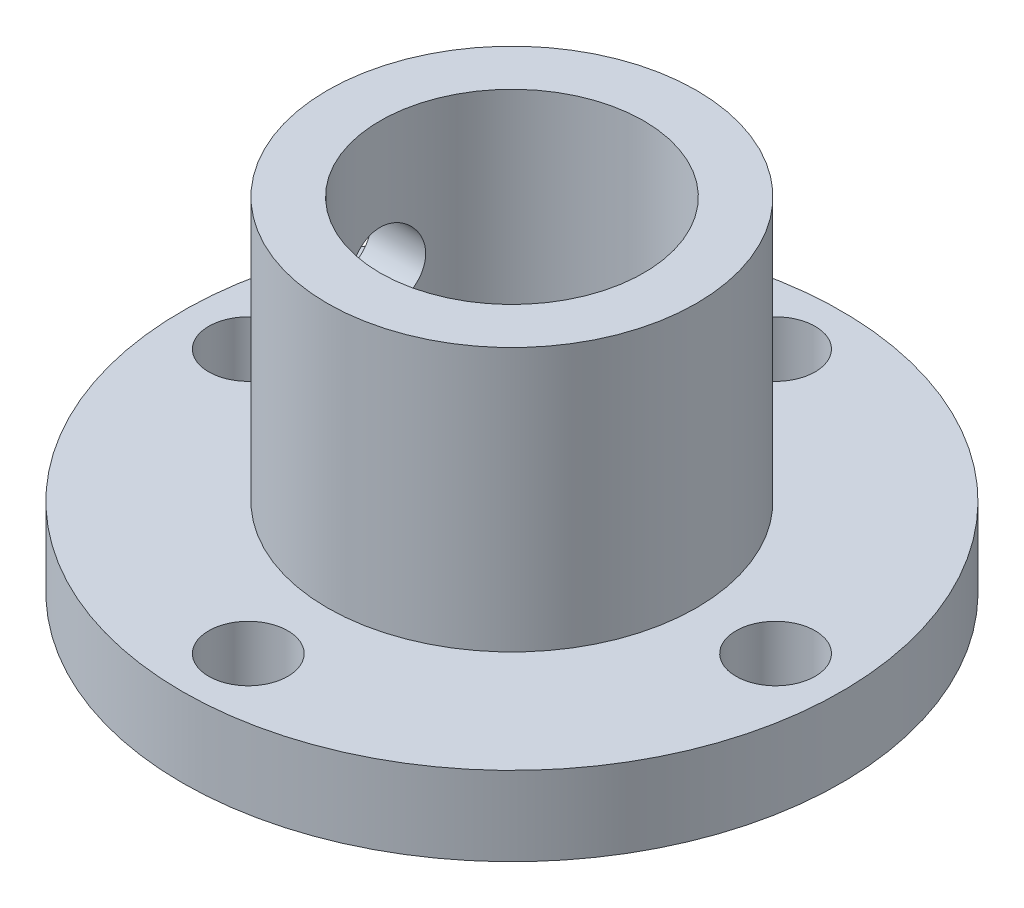
ISO-10303-21;
HEADER;
FILE_DESCRIPTION(('STEP AP214'),'2;1');
FILE_NAME('part.step','',(''),(''),'','','');
FILE_SCHEMA(('AUTOMOTIVE_DESIGN { 1 0 10303 214 1 1 1 1 }'));
ENDSEC;
DATA;
#1=APPLICATION_CONTEXT('core data for automotive mechanical design processes');
#2=APPLICATION_PROTOCOL_DEFINITION('international standard','automotive_design',2000,#1);
#3=PRODUCT_CONTEXT('',#1,'mechanical');
#4=PRODUCT('Part','Part','',(#3));
#5=PRODUCT_RELATED_PRODUCT_CATEGORY('part','',(#4));
#6=PRODUCT_DEFINITION_FORMATION('','',#4);
#7=PRODUCT_DEFINITION_CONTEXT('part definition',#1,'design');
#8=PRODUCT_DEFINITION('design','',#6,#7);
#9=PRODUCT_DEFINITION_SHAPE('','',#8);
#10=(LENGTH_UNIT() NAMED_UNIT(*) SI_UNIT(.MILLI.,.METRE.));
#11=(NAMED_UNIT(*) PLANE_ANGLE_UNIT() SI_UNIT($,.RADIAN.));
#12=(NAMED_UNIT(*) SI_UNIT($,.STERADIAN.) SOLID_ANGLE_UNIT());
#13=UNCERTAINTY_MEASURE_WITH_UNIT(LENGTH_MEASURE(1.E-05),#10,'distance_accuracy_value','');
#14=(GEOMETRIC_REPRESENTATION_CONTEXT(3) GLOBAL_UNCERTAINTY_ASSIGNED_CONTEXT((#13)) GLOBAL_UNIT_ASSIGNED_CONTEXT((#10,
#11,#12)) REPRESENTATION_CONTEXT('',''));
#15=CARTESIAN_POINT('',(0.,0.,0.));
#16=DIRECTION('',(0.,0.,1.));
#17=DIRECTION('',(1.,0.,0.));
#18=AXIS2_PLACEMENT_3D('',#15,#16,#17);
#19=CARTESIAN_POINT('',(0.,3.,0.));
#20=DIRECTION('',(0.,1.,0.));
#21=DIRECTION('',(0.,0.,1.));
#22=AXIS2_PLACEMENT_3D('',#19,#20,#21);
#23=PLANE('',#22);
#24=CARTESIAN_POINT('',(0.,3.,0.));
#25=DIRECTION('',(0.,1.,0.));
#26=DIRECTION('',(1.,0.,0.));
#27=AXIS2_PLACEMENT_3D('',#24,#25,#26);
#28=CIRCLE('',#27,7.);
#29=CARTESIAN_POINT('',(7.,3.,0.));
#30=VERTEX_POINT('',#29);
#31=EDGE_CURVE('E90',#30,#30,#28,.T.);
#32=ORIENTED_EDGE('',*,*,#31,.F.);
#33=EDGE_LOOP('',(#32));
#34=FACE_BOUND('',#33,.T.);
#35=CARTESIAN_POINT('',(-10.,3.,0.));
#36=DIRECTION('',(0.,1.,0.));
#37=DIRECTION('',(0.,0.,1.));
#38=AXIS2_PLACEMENT_3D('',#35,#36,#37);
#39=CIRCLE('',#38,1.5);
#40=CARTESIAN_POINT('',(-10.,3.,1.5));
#41=VERTEX_POINT('',#40);
#42=EDGE_CURVE('E75',#41,#41,#39,.T.);
#43=ORIENTED_EDGE('',*,*,#42,.F.);
#44=EDGE_LOOP('',(#43));
#45=FACE_BOUND('',#44,.T.);
#46=CARTESIAN_POINT('',(10.,3.,0.));
#47=DIRECTION('',(0.,1.,0.));
#48=DIRECTION('',(0.,0.,1.));
#49=AXIS2_PLACEMENT_3D('',#46,#47,#48);
#50=CIRCLE('',#49,1.5);
#51=CARTESIAN_POINT('',(10.,3.,1.5));
#52=VERTEX_POINT('',#51);
#53=EDGE_CURVE('E64',#52,#52,#50,.T.);
#54=ORIENTED_EDGE('',*,*,#53,.F.);
#55=EDGE_LOOP('',(#54));
#56=FACE_BOUND('',#55,.T.);
#57=CARTESIAN_POINT('',(0.,3.,0.));
#58=DIRECTION('',(0.,1.,0.));
#59=DIRECTION('',(0.,0.,1.));
#60=AXIS2_PLACEMENT_3D('',#57,#58,#59);
#61=CIRCLE('',#60,12.5);
#62=CARTESIAN_POINT('',(0.,3.,12.5));
#63=VERTEX_POINT('',#62);
#64=EDGE_CURVE('E56',#63,#63,#61,.T.);
#65=ORIENTED_EDGE('',*,*,#64,.T.);
#66=EDGE_LOOP('',(#65));
#67=FACE_BOUND('',#66,.T.);
#68=CARTESIAN_POINT('',(0.,3.,10.));
#69=DIRECTION('',(0.,1.,0.));
#70=DIRECTION('',(0.,0.,1.));
#71=AXIS2_PLACEMENT_3D('',#68,#69,#70);
#72=CIRCLE('',#71,1.5);
#73=CARTESIAN_POINT('',(0.,3.,11.5));
#74=VERTEX_POINT('',#73);
#75=EDGE_CURVE('E69',#74,#74,#72,.T.);
#76=ORIENTED_EDGE('',*,*,#75,.F.);
#77=EDGE_LOOP('',(#76));
#78=FACE_BOUND('',#77,.T.);
#79=CARTESIAN_POINT('',(0.,3.,-10.));
#80=DIRECTION('',(0.,1.,0.));
#81=DIRECTION('',(0.,0.,1.));
#82=AXIS2_PLACEMENT_3D('',#79,#80,#81);
#83=CIRCLE('',#82,1.5);
#84=CARTESIAN_POINT('',(0.,3.,-8.5));
#85=VERTEX_POINT('',#84);
#86=EDGE_CURVE('E81',#85,#85,#83,.T.);
#87=ORIENTED_EDGE('',*,*,#86,.F.);
#88=EDGE_LOOP('',(#87));
#89=FACE_BOUND('',#88,.T.);
#90=ADVANCED_FACE('F43',(#34,#45,#56,#67,#78,#89),#23,.T.);
#91=CARTESIAN_POINT('',(0.,0.,0.));
#92=DIRECTION('',(0.,1.,0.));
#93=DIRECTION('',(0.,0.,1.));
#94=AXIS2_PLACEMENT_3D('',#91,#92,#93);
#95=PLANE('',#94);
#96=CARTESIAN_POINT('',(0.,0.,0.));
#97=DIRECTION('',(0.,1.,0.));
#98=DIRECTION('',(0.,0.,1.));
#99=AXIS2_PLACEMENT_3D('',#96,#97,#98);
#100=CIRCLE('',#99,12.5);
#101=CARTESIAN_POINT('',(0.,0.,12.5));
#102=VERTEX_POINT('',#101);
#103=EDGE_CURVE('E60',#102,#102,#100,.T.);
#104=ORIENTED_EDGE('',*,*,#103,.F.);
#105=EDGE_LOOP('',(#104));
#106=FACE_BOUND('',#105,.T.);
#107=CARTESIAN_POINT('',(10.,0.,0.));
#108=DIRECTION('',(0.,1.,0.));
#109=DIRECTION('',(0.,0.,1.));
#110=AXIS2_PLACEMENT_3D('',#107,#108,#109);
#111=CIRCLE('',#110,1.5);
#112=CARTESIAN_POINT('',(10.,0.,1.5));
#113=VERTEX_POINT('',#112);
#114=EDGE_CURVE('E66',#113,#113,#111,.T.);
#115=ORIENTED_EDGE('',*,*,#114,.T.);
#116=EDGE_LOOP('',(#115));
#117=FACE_BOUND('',#116,.T.);
#118=CARTESIAN_POINT('',(0.,0.,10.));
#119=DIRECTION('',(0.,1.,0.));
#120=DIRECTION('',(0.,0.,1.));
#121=AXIS2_PLACEMENT_3D('',#118,#119,#120);
#122=CIRCLE('',#121,1.5);
#123=CARTESIAN_POINT('',(0.,0.,11.5));
#124=VERTEX_POINT('',#123);
#125=EDGE_CURVE('E72',#124,#124,#122,.T.);
#126=ORIENTED_EDGE('',*,*,#125,.T.);
#127=EDGE_LOOP('',(#126));
#128=FACE_BOUND('',#127,.T.);
#129=CARTESIAN_POINT('',(-10.,0.,0.));
#130=DIRECTION('',(0.,1.,0.));
#131=DIRECTION('',(0.,0.,1.));
#132=AXIS2_PLACEMENT_3D('',#129,#130,#131);
#133=CIRCLE('',#132,1.5);
#134=CARTESIAN_POINT('',(-10.,0.,1.5));
#135=VERTEX_POINT('',#134);
#136=EDGE_CURVE('E78',#135,#135,#133,.T.);
#137=ORIENTED_EDGE('',*,*,#136,.T.);
#138=EDGE_LOOP('',(#137));
#139=FACE_BOUND('',#138,.T.);
#140=CARTESIAN_POINT('',(0.,0.,-10.));
#141=DIRECTION('',(0.,1.,0.));
#142=DIRECTION('',(0.,0.,1.));
#143=AXIS2_PLACEMENT_3D('',#140,#141,#142);
#144=CIRCLE('',#143,1.5);
#145=CARTESIAN_POINT('',(0.,0.,-8.5));
#146=VERTEX_POINT('',#145);
#147=EDGE_CURVE('E84',#146,#146,#144,.T.);
#148=ORIENTED_EDGE('',*,*,#147,.T.);
#149=EDGE_LOOP('',(#148));
#150=FACE_BOUND('',#149,.T.);
#151=ADVANCED_FACE('F131',(#106,#117,#128,#139,#150),#95,.F.);
#152=CARTESIAN_POINT('',(0.,3.,0.));
#153=DIRECTION('',(0.,-1.,0.));
#154=DIRECTION('',(0.,0.,-1.));
#155=AXIS2_PLACEMENT_3D('',#152,#153,#154);
#156=CYLINDRICAL_SURFACE('',#155,12.5);
#157=ORIENTED_EDGE('',*,*,#64,.F.);
#158=EDGE_LOOP('',(#157));
#159=FACE_BOUND('',#158,.T.);
#160=ORIENTED_EDGE('',*,*,#103,.T.);
#161=EDGE_LOOP('',(#160));
#162=FACE_BOUND('',#161,.T.);
#163=ADVANCED_FACE('F45',(#159,#162),#156,.T.);
#164=CARTESIAN_POINT('',(10.,3.,0.));
#165=DIRECTION('',(0.,-1.,0.));
#166=DIRECTION('',(0.,0.,-1.));
#167=AXIS2_PLACEMENT_3D('',#164,#165,#166);
#168=CYLINDRICAL_SURFACE('',#167,1.5);
#169=ORIENTED_EDGE('',*,*,#53,.T.);
#170=EDGE_LOOP('',(#169));
#171=FACE_BOUND('',#170,.T.);
#172=ORIENTED_EDGE('',*,*,#114,.F.);
#173=EDGE_LOOP('',(#172));
#174=FACE_BOUND('',#173,.T.);
#175=ADVANCED_FACE('F204',(#171,#174),#168,.F.);
#176=CARTESIAN_POINT('',(0.,3.,10.));
#177=DIRECTION('',(0.,-1.,0.));
#178=DIRECTION('',(0.,0.,-1.));
#179=AXIS2_PLACEMENT_3D('',#176,#177,#178);
#180=CYLINDRICAL_SURFACE('',#179,1.5);
#181=ORIENTED_EDGE('',*,*,#75,.T.);
#182=EDGE_LOOP('',(#181));
#183=FACE_BOUND('',#182,.T.);
#184=ORIENTED_EDGE('',*,*,#125,.F.);
#185=EDGE_LOOP('',(#184));
#186=FACE_BOUND('',#185,.T.);
#187=ADVANCED_FACE('F193',(#183,#186),#180,.F.);
#188=CARTESIAN_POINT('',(-10.,3.,0.));
#189=DIRECTION('',(0.,-1.,0.));
#190=DIRECTION('',(0.,0.,-1.));
#191=AXIS2_PLACEMENT_3D('',#188,#189,#190);
#192=CYLINDRICAL_SURFACE('',#191,1.5);
#193=ORIENTED_EDGE('',*,*,#42,.T.);
#194=EDGE_LOOP('',(#193));
#195=FACE_BOUND('',#194,.T.);
#196=ORIENTED_EDGE('',*,*,#136,.F.);
#197=EDGE_LOOP('',(#196));
#198=FACE_BOUND('',#197,.T.);
#199=ADVANCED_FACE('F127',(#195,#198),#192,.F.);
#200=CARTESIAN_POINT('',(0.,3.,-10.));
#201=DIRECTION('',(0.,-1.,0.));
#202=DIRECTION('',(0.,0.,-1.));
#203=AXIS2_PLACEMENT_3D('',#200,#201,#202);
#204=CYLINDRICAL_SURFACE('',#203,1.5);
#205=ORIENTED_EDGE('',*,*,#86,.T.);
#206=EDGE_LOOP('',(#205));
#207=FACE_BOUND('',#206,.T.);
#208=ORIENTED_EDGE('',*,*,#147,.F.);
#209=EDGE_LOOP('',(#208));
#210=FACE_BOUND('',#209,.T.);
#211=ADVANCED_FACE('F120',(#207,#210),#204,.F.);
#212=CARTESIAN_POINT('',(0.,13.,0.));
#213=DIRECTION('',(0.,1.,0.));
#214=DIRECTION('',(0.,0.,1.));
#215=AXIS2_PLACEMENT_3D('',#212,#213,#214);
#216=PLANE('',#215);
#217=CARTESIAN_POINT('',(0.,13.,0.));
#218=DIRECTION('',(0.,1.,0.));
#219=DIRECTION('',(1.,0.,0.));
#220=AXIS2_PLACEMENT_3D('',#217,#218,#219);
#221=CIRCLE('',#220,7.);
#222=CARTESIAN_POINT('',(7.,13.,0.));
#223=VERTEX_POINT('',#222);
#224=EDGE_CURVE('E87',#223,#223,#221,.T.);
#225=ORIENTED_EDGE('',*,*,#224,.T.);
#226=EDGE_LOOP('',(#225));
#227=FACE_BOUND('',#226,.T.);
#228=CARTESIAN_POINT('',(0.,13.,0.));
#229=DIRECTION('',(0.,1.,0.));
#230=DIRECTION('',(0.,0.,1.));
#231=AXIS2_PLACEMENT_3D('',#228,#229,#230);
#232=CIRCLE('',#231,5.);
#233=CARTESIAN_POINT('',(0.,13.,5.));
#234=VERTEX_POINT('',#233);
#235=EDGE_CURVE('E93',#234,#234,#232,.T.);
#236=ORIENTED_EDGE('',*,*,#235,.F.);
#237=EDGE_LOOP('',(#236));
#238=FACE_BOUND('',#237,.T.);
#239=ADVANCED_FACE('F118',(#227,#238),#216,.T.);
#240=CARTESIAN_POINT('',(0.,13.,0.));
#241=DIRECTION('',(0.,-1.,0.));
#242=DIRECTION('',(0.,0.,-1.));
#243=AXIS2_PLACEMENT_3D('',#240,#241,#242);
#244=CYLINDRICAL_SURFACE('',#243,7.);
#245=CARTESIAN_POINT('',(-6.83739716558867,8.,-1.5));
#246=CARTESIAN_POINT('',(-6.83739884558951,8.08321115248195,-1.49999708238613));
#247=CARTESIAN_POINT('',(-6.83893272341929,8.16645777394212,-1.49305236244768));
#248=CARTESIAN_POINT('',(-6.84489178429867,8.33058667224201,-1.46548559252999));
#249=CARTESIAN_POINT('',(-6.84931911211841,8.41146714867621,-1.44485339653622));
#250=CARTESIAN_POINT('',(-6.86054115293409,8.5684657495742,-1.39058863684599));
#251=CARTESIAN_POINT('',(-6.86733332725825,8.64458887812147,-1.35697000991314));
#252=CARTESIAN_POINT('',(-6.88251670848644,8.79011527394461,-1.27772617673341));
#253=CARTESIAN_POINT('',(-6.89090786877545,8.85951873702908,-1.23210132048776));
#254=CARTESIAN_POINT('',(-6.90849578796654,8.99076296148212,-1.12935142570221));
#255=CARTESIAN_POINT('',(-6.91770249871754,9.05247887623996,-1.07206859483983));
#256=CARTESIAN_POINT('',(-6.93579691710397,9.16550355440578,-0.947969508129577));
#257=CARTESIAN_POINT('',(-6.94468460051417,9.21681152886007,-0.881152530217676));
#258=CARTESIAN_POINT('',(-6.96124769109432,9.30805544449143,-0.739047288464582));
#259=CARTESIAN_POINT('',(-6.96890998819429,9.34787165577062,-0.663680488229954));
#260=CARTESIAN_POINT('',(-6.98204671042934,9.41422769144629,-0.507134269342596));
#261=CARTESIAN_POINT('',(-6.98752137103329,9.44076894478628,-0.425955477380312));
#262=CARTESIAN_POINT('',(-6.9955956528118,9.47942997093134,-0.261387187671512));
#263=CARTESIAN_POINT('',(-6.99823733378385,9.49176092855243,-0.178049400596923));
#264=CARTESIAN_POINT('',(-7.00049362207002,9.50231127731326,-0.0104489453066449));
#265=CARTESIAN_POINT('',(-7.00010856232698,9.50053222056076,0.0738136201647589));
#266=CARTESIAN_POINT('',(-6.99638700862558,9.48307103533642,0.239417029250511));
#267=CARTESIAN_POINT('',(-6.99309883152432,9.46761649971008,0.320783115362112));
#268=CARTESIAN_POINT('',(-6.98399541589104,9.42360531814814,0.479739463978388));
#269=CARTESIAN_POINT('',(-6.97818006616518,9.39504809570026,0.557329560175054));
#270=CARTESIAN_POINT('',(-6.96459754646858,9.32543854111148,0.707167497556552));
#271=CARTESIAN_POINT('',(-6.95681685803946,9.28429923279565,0.779373657015788));
#272=CARTESIAN_POINT('',(-6.94015793743865,9.1907580318364,0.915940926562845));
#273=CARTESIAN_POINT('',(-6.93127956144693,9.1383546626997,0.980301006451528));
#274=CARTESIAN_POINT('',(-6.91319326460925,9.02253145547214,1.10070208800198));
#275=CARTESIAN_POINT('',(-6.90398230372853,8.95891242064296,1.1565511732025));
#276=CARTESIAN_POINT('',(-6.88643566831974,8.82311671493149,1.25682243234728));
#277=CARTESIAN_POINT('',(-6.87810001563386,8.75093983059475,1.30124432118068));
#278=CARTESIAN_POINT('',(-6.86324023586723,8.59977549893624,1.37748077573296));
#279=CARTESIAN_POINT('',(-6.85672115127775,8.52076987614756,1.40926035088923));
#280=CARTESIAN_POINT('',(-6.84630340806617,8.35836723405356,1.45903495159115));
#281=CARTESIAN_POINT('',(-6.84240435218483,8.27497088255681,1.47703206694628));
#282=CARTESIAN_POINT('',(-6.83774881255446,8.10790424735029,1.49843586024652));
#283=CARTESIAN_POINT('',(-6.83693227051701,8.0242713249227,1.5021214192864));
#284=CARTESIAN_POINT('',(-6.83837239573993,7.85758600681831,1.49555139642373));
#285=CARTESIAN_POINT('',(-6.84062886101063,7.77453357334645,1.48529673081635));
#286=CARTESIAN_POINT('',(-6.84790415484206,7.61232956501924,1.45137894635584));
#287=CARTESIAN_POINT('',(-6.85289155274364,7.53314456740304,1.42786830251553));
#288=CARTESIAN_POINT('',(-6.86503859869777,7.37983766246708,1.36827052946749));
#289=CARTESIAN_POINT('',(-6.87219844772849,7.30571622436581,1.33218223662818));
#290=CARTESIAN_POINT('',(-6.88801634080345,7.16343031524108,1.24783504416705));
#291=CARTESIAN_POINT('',(-6.89669501746317,7.09537041798782,1.19940368590792));
#292=CARTESIAN_POINT('',(-6.91451775360139,6.96824165412621,1.09197183833601));
#293=CARTESIAN_POINT('',(-6.92366186834461,6.90917385855153,1.03297009182161));
#294=CARTESIAN_POINT('',(-6.94158239990173,6.80062969705524,0.904812764420814));
#295=CARTESIAN_POINT('',(-6.95034935607746,6.75134308384299,0.835494925828771));
#296=CARTESIAN_POINT('',(-6.96635610714901,6.66511459064895,0.689401481282277));
#297=CARTESIAN_POINT('',(-6.97359597176692,6.62817214702717,0.61262621604374));
#298=CARTESIAN_POINT('',(-6.98569278381574,6.56794794536152,0.454265418982041));
#299=CARTESIAN_POINT('',(-6.99056443803698,6.54458169625372,0.372713193075173));
#300=CARTESIAN_POINT('',(-6.9974393930198,6.51190829426768,0.20672517700329));
#301=CARTESIAN_POINT('',(-6.99944309312296,6.50259918402609,0.122289789973994));
#302=CARTESIAN_POINT('',(-7.00034511009057,6.49838934758814,-0.0452637170528279));
#303=CARTESIAN_POINT('',(-6.99930459001667,6.50320484139538,-0.128374505509228));
#304=CARTESIAN_POINT('',(-6.99436552363383,6.52647476351903,-0.292572938415959));
#305=CARTESIAN_POINT('',(-6.99046702473686,6.54492896557832,-0.373660616405284));
#306=CARTESIAN_POINT('',(-6.98025388638537,6.59481880624949,-0.531301948487269));
#307=CARTESIAN_POINT('',(-6.97394646430492,6.62621568938556,-0.607868365073176));
#308=CARTESIAN_POINT('',(-6.95959036050661,6.70106127116912,-0.754684956723219));
#309=CARTESIAN_POINT('',(-6.9515415172034,6.74451108830603,-0.82493454479614));
#310=CARTESIAN_POINT('',(-6.93439809934494,6.84316231874267,-0.958512306895243));
#311=CARTESIAN_POINT('',(-6.92528708907874,6.89856415832131,-1.02169036510577));
#312=CARTESIAN_POINT('',(-6.90713690075836,7.01914061025035,-1.13795001457643));
#313=CARTESIAN_POINT('',(-6.89809774045682,7.08431756335561,-1.19102918062422));
#314=CARTESIAN_POINT('',(-6.88098693651916,7.22359049318568,-1.28623261596675));
#315=CARTESIAN_POINT('',(-6.87292905956533,7.29778935828702,-1.32820897809616));
#316=CARTESIAN_POINT('',(-6.85886497228049,7.45234372092325,-1.39903004659825));
#317=CARTESIAN_POINT('',(-6.85285699581573,7.53269384525307,-1.42788606423931));
#318=CARTESIAN_POINT('',(-6.84470560641996,7.67762613118586,-1.46638607121557));
#319=CARTESIAN_POINT('',(-6.84198283087953,7.74141167570783,-1.47896752507743));
#320=CARTESIAN_POINT('',(-6.83832799504406,7.87012431157732,-1.49577544043437));
#321=CARTESIAN_POINT('',(-6.83739585430069,7.93505135150832,-1.50000227727981));
#322=CARTESIAN_POINT('',(-6.83739716558867,8.,-1.5));
#323=B_SPLINE_CURVE_WITH_KNOTS('',3,(#245,#246,#247,#248,#249,#250,#251,#252,#253,#254,#255,
#256,#257,#258,#259,#260,#261,#262,#263,#264,#265,#266,#267,#268,#269,#270,#271,#272,#273,#274,
#275,#276,#277,#278,#279,#280,#281,#282,#283,#284,#285,#286,#287,#288,#289,#290,#291,#292,#293,
#294,#295,#296,#297,#298,#299,#300,#301,#302,#303,#304,#305,#306,#307,#308,#309,#310,#311,#312,
#313,#314,#315,#316,#317,#318,#319,#320,#321,#322),.UNSPECIFIED.,.T.,.F.,(4,2,2,2,2,2,2,2,2,2,2,
2,2,2,2,2,2,2,2,2,2,2,2,2,2,2,2,2,2,2,2,2,2,2,2,2,2,2,4),(0.,0.249395482027529,
0.498976038479964,0.748289491152758,0.997595676735284,1.25053229582692,1.50348808112879,
1.75899134820278,2.01446710646268,2.26609508151929,2.51769537777241,2.76518557667371,
3.01268666607584,3.26193888143437,3.51122378872315,3.76548960779295,4.01976177023092,
4.27473287411781,4.52966530953839,4.77960433192523,5.02952692653916,5.27663180749375,
5.5237595556315,5.77455010216318,6.02537049659078,6.2806621468321,6.53594213875541,
6.78961589824375,7.04325433208539,7.29183199644126,7.54040553715099,7.78824009619483,
8.03609766151365,8.28848914160965,8.54094115631232,8.79660380167248,9.05204561611687,
9.24671456122271,9.44137476018022),.UNSPECIFIED.);
#324=CARTESIAN_POINT('',(-6.83739716558867,8.,-1.5));
#325=VERTEX_POINT('',#324);
#326=EDGE_CURVE('E98',#325,#325,#323,.T.);
#327=ORIENTED_EDGE('',*,*,#326,.T.);
#328=EDGE_LOOP('',(#327));
#329=FACE_BOUND('',#328,.T.);
#330=ORIENTED_EDGE('',*,*,#224,.F.);
#331=EDGE_LOOP('',(#330));
#332=FACE_BOUND('',#331,.T.);
#333=ORIENTED_EDGE('',*,*,#31,.T.);
#334=EDGE_LOOP('',(#333));
#335=FACE_BOUND('',#334,.T.);
#336=ADVANCED_FACE('F104',(#329,#332,#335),#244,.T.);
#337=CARTESIAN_POINT('',(0.,13.,0.));
#338=DIRECTION('',(0.,-1.,0.));
#339=DIRECTION('',(0.,0.,-1.));
#340=AXIS2_PLACEMENT_3D('',#337,#338,#339);
#341=CYLINDRICAL_SURFACE('',#340,5.);
#342=CARTESIAN_POINT('',(-4.76969600708473,8.,-1.5));
#343=CARTESIAN_POINT('',(-4.7696968572698,8.0821945479424,-1.49999897633764));
#344=CARTESIAN_POINT('',(-4.77184390209069,8.16439922414402,-1.49322108167142));
#345=CARTESIAN_POINT('',(-4.780165783029,8.32640524959194,-1.46635844446749));
#346=CARTESIAN_POINT('',(-4.78634196493468,8.40620578650146,-1.44626925573578));
#347=CARTESIAN_POINT('',(-4.80196102485632,8.56103472827173,-1.39352753269955));
#348=CARTESIAN_POINT('',(-4.81139846703232,8.63607082963309,-1.36089589394243));
#349=CARTESIAN_POINT('',(-4.83246932547567,8.7796219339953,-1.28406421917929));
#350=CARTESIAN_POINT('',(-4.84410307041019,8.84813595868444,-1.23986245137053));
#351=CARTESIAN_POINT('',(-4.86866862185765,8.97886639057737,-1.13964754141627));
#352=CARTESIAN_POINT('',(-4.88162808311636,9.04084589794629,-1.08333207175807));
#353=CARTESIAN_POINT('',(-4.90714861936757,9.15463795132251,-0.9611362375796));
#354=CARTESIAN_POINT('',(-4.91970964297705,9.20644919044988,-0.895254645461112));
#355=CARTESIAN_POINT('',(-4.94333214579389,9.29946269983331,-0.754111437793691));
#356=CARTESIAN_POINT('',(-4.95435724342404,9.34042342444281,-0.678684021335816));
#357=CARTESIAN_POINT('',(-4.97334435920684,9.40898725904276,-0.521624645369355));
#358=CARTESIAN_POINT('',(-4.98130703789495,9.43659324985745,-0.439994028387913));
#359=CARTESIAN_POINT('',(-4.99307646003589,9.47688000109051,-0.27532385263083));
#360=CARTESIAN_POINT('',(-4.99699557369338,9.4899651276527,-0.192391398953802));
#361=CARTESIAN_POINT('',(-5.00063201501348,9.50211732464644,-0.0254218237493157));
#362=CARTESIAN_POINT('',(-5.00035022521079,9.50118733940196,0.0586150620503675));
#363=CARTESIAN_POINT('',(-4.99569603817659,9.48560713145698,0.222571156600159));
#364=CARTESIAN_POINT('',(-4.9914542020526,9.47139480619013,0.30253626764134));
#365=CARTESIAN_POINT('',(-4.97951522112593,9.43036866400571,0.458889213442526));
#366=CARTESIAN_POINT('',(-4.97181785750586,9.40355404905733,0.535276821322845));
#367=CARTESIAN_POINT('',(-4.95365220986963,9.33778797658144,0.68334732635128));
#368=CARTESIAN_POINT('',(-4.94315269676706,9.29869879719273,0.754965064694477));
#369=CARTESIAN_POINT('',(-4.92049640648069,9.20960214757177,0.890764673783155));
#370=CARTESIAN_POINT('',(-4.90833923637778,9.15959208703652,0.95494477487213));
#371=CARTESIAN_POINT('',(-4.88311550488166,9.0478022492484,1.0766604815298));
#372=CARTESIAN_POINT('',(-4.87003195321461,8.98564308097026,1.13384458040111));
#373=CARTESIAN_POINT('',(-4.84483979887497,8.85248998210995,1.23707651539823));
#374=CARTESIAN_POINT('',(-4.8327312931702,8.78149517461077,1.28312324482852));
#375=CARTESIAN_POINT('',(-4.81077903197678,8.63176053075101,1.3631399533545));
#376=CARTESIAN_POINT('',(-4.80095810695957,8.55295295413708,1.39698989237679));
#377=CARTESIAN_POINT('',(-4.78496392548436,8.39039279155446,1.45083362878413));
#378=CARTESIAN_POINT('',(-4.7787894791583,8.30664182846544,1.4708319464056));
#379=CARTESIAN_POINT('',(-4.77104849541241,8.13991763926072,1.49574770282165));
#380=CARTESIAN_POINT('',(-4.76931878670441,8.05703177610602,1.50119946380212));
#381=CARTESIAN_POINT('',(-4.77021192441924,7.89152709999014,1.49835947233062));
#382=CARTESIAN_POINT('',(-4.77283416156589,7.80890825126915,1.4900696437133));
#383=CARTESIAN_POINT('',(-4.78197558554912,7.64851162202913,1.4604576357419));
#384=CARTESIAN_POINT('',(-4.78839176507489,7.57066383573648,1.4394796143128));
#385=CARTESIAN_POINT('',(-4.80429141231227,7.41959830918509,1.3854857774794));
#386=CARTESIAN_POINT('',(-4.81377535359073,7.34638128585943,1.3524681034276));
#387=CARTESIAN_POINT('',(-4.83505835023047,7.20448253592787,1.274318711965));
#388=CARTESIAN_POINT('',(-4.84691271069799,7.13597527901421,1.22888564172729));
#389=CARTESIAN_POINT('',(-4.87148205646987,7.0073618938192,1.12755301600385));
#390=CARTESIAN_POINT('',(-4.88419724730003,6.94725778238721,1.07165095534897));
#391=CARTESIAN_POINT('',(-4.90963633548158,6.83481959418526,0.9484551324936));
#392=CARTESIAN_POINT('',(-4.92234245063004,6.78286437101302,0.880811065857435));
#393=CARTESIAN_POINT('',(-4.94584851748651,6.69103329897225,0.73746178459025));
#394=CARTESIAN_POINT('',(-4.95664856384717,6.65115685021854,0.661756970543945));
#395=CARTESIAN_POINT('',(-4.97505970474957,6.58499996943171,0.504935504705222));
#396=CARTESIAN_POINT('',(-4.98269453424966,6.55861798384103,0.42386462203784));
#397=CARTESIAN_POINT('',(-4.99401979596827,6.51993908110958,0.258169966504589));
#398=CARTESIAN_POINT('',(-4.9977113567088,6.50763813405158,0.173547217354764));
#399=CARTESIAN_POINT('',(-5.00066544081399,6.4977769559455,0.00665215388274413));
#400=CARTESIAN_POINT('',(-5.00009305111322,6.49966730459217,-0.0755851790862051));
#401=CARTESIAN_POINT('',(-4.99497264465037,6.51682163249912,-0.238519481164402));
#402=CARTESIAN_POINT('',(-4.99042485330462,6.53208485348044,-0.319216537346527));
#403=CARTESIAN_POINT('',(-4.97791168358327,6.57521166139962,-0.475935813041357));
#404=CARTESIAN_POINT('',(-4.96998352900866,6.60293818064901,-0.55199892735139));
#405=CARTESIAN_POINT('',(-4.9515294303945,6.67008191450719,-0.698433237752051));
#406=CARTESIAN_POINT('',(-4.94100305949946,6.70950105028619,-0.768803496050578));
#407=CARTESIAN_POINT('',(-4.91803965828228,6.80037345743004,-0.904301892420563));
#408=CARTESIAN_POINT('',(-4.90555226923559,6.85217143000077,-0.969190250076767));
#409=CARTESIAN_POINT('',(-4.88023537212334,6.9657103883328,-1.08953757134594));
#410=CARTESIAN_POINT('',(-4.86740576641079,7.02745423789815,-1.14499380960193));
#411=CARTESIAN_POINT('',(-4.84240680631319,7.16134077831051,-1.24656269394549));
#412=CARTESIAN_POINT('',(-4.83026852693485,7.23373855339044,-1.29234759757956));
#413=CARTESIAN_POINT('',(-4.80852547508793,7.38555517416102,-1.37104313528776));
#414=CARTESIAN_POINT('',(-4.79891948596955,7.46497062360119,-1.40395995557288));
#415=CARTESIAN_POINT('',(-4.78427816717595,7.61974043160627,-1.45301942532949));
#416=CARTESIAN_POINT('',(-4.7788615484052,7.69460864693099,-1.47058859011232));
#417=CARTESIAN_POINT('',(-4.77157042597167,7.84631522249577,-1.49407818835144));
#418=CARTESIAN_POINT('',(-4.7696952122143,7.92315318464525,-1.50000095706095));
#419=CARTESIAN_POINT('',(-4.76969600708473,8.,-1.5));
#420=B_SPLINE_CURVE_WITH_KNOTS('',3,(#342,#343,#344,#345,#346,#347,#348,#349,#350,#351,#352,
#353,#354,#355,#356,#357,#358,#359,#360,#361,#362,#363,#364,#365,#366,#367,#368,#369,#370,#371,
#372,#373,#374,#375,#376,#377,#378,#379,#380,#381,#382,#383,#384,#385,#386,#387,#388,#389,#390,
#391,#392,#393,#394,#395,#396,#397,#398,#399,#400,#401,#402,#403,#404,#405,#406,#407,#408,#409,
#410,#411,#412,#413,#414,#415,#416,#417,#418,#419),.UNSPECIFIED.,.T.,.F.,(4,2,2,2,2,2,2,2,2,2,2,
2,2,2,2,2,2,2,2,2,2,2,2,2,2,2,2,2,2,2,2,2,2,2,2,2,2,2,4),(0.,0.246300165915542,
0.492682641688999,0.738656414466193,0.9846670253701,1.23773150007984,1.49082847871273,
1.74915939273644,2.00743455587877,2.25832140149558,2.5091555410144,2.7520012599088,
2.99486235890376,3.24055209335676,3.4863001659083,3.74152147023278,3.99676812491863,
4.25446238246266,4.51207250628411,4.76008080790309,5.00805439107387,5.24958594938817,
5.49115481045787,5.73920731809388,5.98731925928923,6.24479506100602,6.50225807324202,
6.75775391814325,7.01317662321682,7.2587630391122,7.50433553047754,7.74727096872219,
7.99024634491378,8.24099627054488,8.4918185262989,8.75011639669147,9.00828993963944,
9.23861153857447,9.4688869503356),.UNSPECIFIED.);
#421=CARTESIAN_POINT('',(-4.76969600708473,8.,-1.5));
#422=VERTEX_POINT('',#421);
#423=EDGE_CURVE('E47',#422,#422,#420,.T.);
#424=ORIENTED_EDGE('',*,*,#423,.F.);
#425=EDGE_LOOP('',(#424));
#426=FACE_BOUND('',#425,.T.);
#427=ORIENTED_EDGE('',*,*,#235,.T.);
#428=EDGE_LOOP('',(#427));
#429=FACE_BOUND('',#428,.T.);
#430=CARTESIAN_POINT('',(0.,3.,0.));
#431=DIRECTION('',(0.,1.,0.));
#432=DIRECTION('',(0.,0.,1.));
#433=AXIS2_PLACEMENT_3D('',#430,#431,#432);
#434=CIRCLE('',#433,5.);
#435=CARTESIAN_POINT('',(0.,3.,5.));
#436=VERTEX_POINT('',#435);
#437=EDGE_CURVE('E11',#436,#436,#434,.F.);
#438=ORIENTED_EDGE('',*,*,#437,.T.);
#439=EDGE_LOOP('',(#438));
#440=FACE_BOUND('',#439,.T.);
#441=ADVANCED_FACE('F113',(#426,#429,#440),#341,.F.);
#442=ORIENTED_EDGE('',*,*,#437,.F.);
#443=EDGE_LOOP('',(#442));
#444=FACE_BOUND('',#443,.T.);
#445=ADVANCED_FACE('F111',(#444),#23,.T.);
#446=CARTESIAN_POINT('',(-12.5,8.,0.));
#447=DIRECTION('',(1.,0.,0.));
#448=DIRECTION('',(0.,0.,-1.));
#449=AXIS2_PLACEMENT_3D('',#446,#447,#448);
#450=CYLINDRICAL_SURFACE('',#449,1.5);
#451=ORIENTED_EDGE('',*,*,#423,.T.);
#452=EDGE_LOOP('',(#451));
#453=FACE_BOUND('',#452,.T.);
#454=ORIENTED_EDGE('',*,*,#326,.F.);
#455=EDGE_LOOP('',(#454));
#456=FACE_BOUND('',#455,.T.);
#457=ADVANCED_FACE('F108',(#453,#456),#450,.F.);
#458=CLOSED_SHELL('',(#90,#151,#163,#175,#187,#199,#211,#239,#336,#441,#445,#457));
#459=MANIFOLD_SOLID_BREP('B2',#458);
#460=ADVANCED_BREP_SHAPE_REPRESENTATION('',(#18,#459),#14);
#461=SHAPE_DEFINITION_REPRESENTATION(#9,#460);
ENDSEC;
END-ISO-10303-21;
